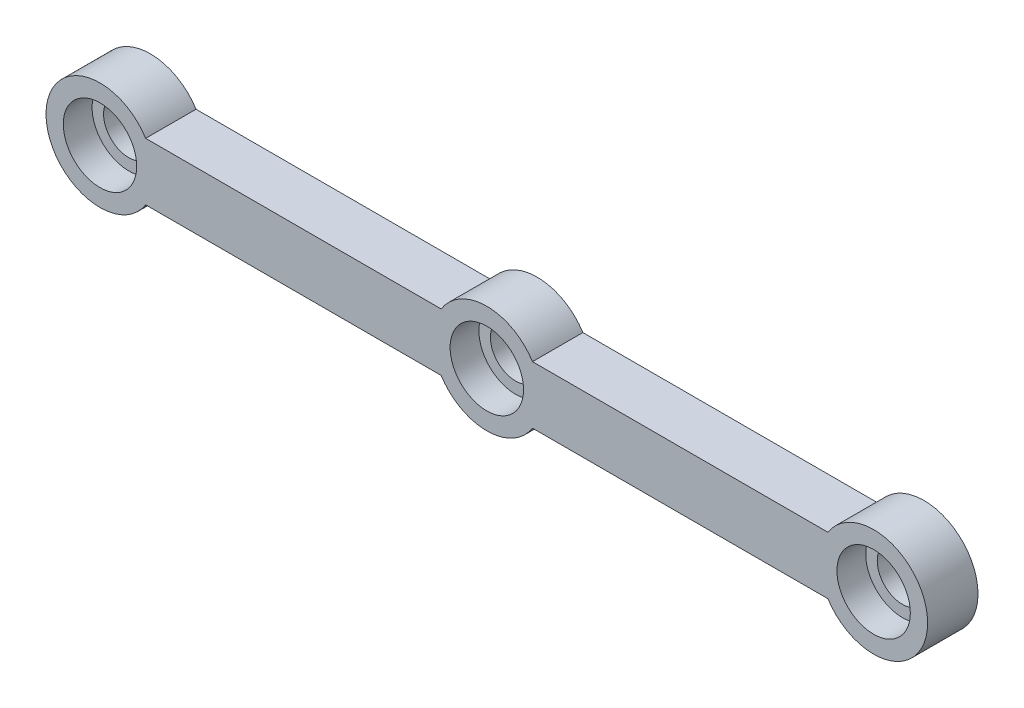
ISO-10303-21;
HEADER;
FILE_DESCRIPTION(('STEP AP214'),'2;1');
FILE_NAME('part.step','',(''),(''),'','','');
FILE_SCHEMA(('AUTOMOTIVE_DESIGN { 1 0 10303 214 1 1 1 1 }'));
ENDSEC;
DATA;
#1=APPLICATION_CONTEXT('core data for automotive mechanical design processes');
#2=APPLICATION_PROTOCOL_DEFINITION('international standard','automotive_design',2000,#1);
#3=PRODUCT_CONTEXT('',#1,'mechanical');
#4=PRODUCT('Part','Part','',(#3));
#5=PRODUCT_RELATED_PRODUCT_CATEGORY('part','',(#4));
#6=PRODUCT_DEFINITION_FORMATION('','',#4);
#7=PRODUCT_DEFINITION_CONTEXT('part definition',#1,'design');
#8=PRODUCT_DEFINITION('design','',#6,#7);
#9=PRODUCT_DEFINITION_SHAPE('','',#8);
#10=(LENGTH_UNIT() NAMED_UNIT(*) SI_UNIT(.MILLI.,.METRE.));
#11=(NAMED_UNIT(*) PLANE_ANGLE_UNIT() SI_UNIT($,.RADIAN.));
#12=(NAMED_UNIT(*) SI_UNIT($,.STERADIAN.) SOLID_ANGLE_UNIT());
#13=UNCERTAINTY_MEASURE_WITH_UNIT(LENGTH_MEASURE(1.E-05),#10,'distance_accuracy_value','');
#14=(GEOMETRIC_REPRESENTATION_CONTEXT(3) GLOBAL_UNCERTAINTY_ASSIGNED_CONTEXT((#13)) GLOBAL_UNIT_ASSIGNED_CONTEXT((#10,
#11,#12)) REPRESENTATION_CONTEXT('',''));
#15=CARTESIAN_POINT('',(0.,0.,0.));
#16=DIRECTION('',(0.,0.,1.));
#17=DIRECTION('',(1.,0.,0.));
#18=AXIS2_PLACEMENT_3D('',#15,#16,#17);
#19=CARTESIAN_POINT('',(-59.9999999999999,4.,3.));
#20=DIRECTION('',(0.,-1.,0.));
#21=DIRECTION('',(0.,0.,-1.));
#22=AXIS2_PLACEMENT_3D('',#19,#20,#21);
#23=PLANE('',#22);
#24=DIRECTION('',(-1.,0.,0.));
#25=VECTOR('',#24,1.);
#26=CARTESIAN_POINT('',(-59.9999999999999,4.,3.));
#27=LINE('',#26,#25);
#28=CARTESIAN_POINT('',(47.3943322578825,4.,3.));
#29=VERTEX_POINT('',#28);
#30=CARTESIAN_POINT('',(6.34428877022483,4.,3.));
#31=VERTEX_POINT('',#30);
#32=EDGE_CURVE('E120',#29,#31,#27,.T.);
#33=ORIENTED_EDGE('',*,*,#32,.F.);
#34=DIRECTION('',(0.,0.,1.));
#35=VECTOR('',#34,1.);
#36=CARTESIAN_POINT('',(47.3943322578825,4.,-4.));
#37=LINE('',#36,#35);
#38=CARTESIAN_POINT('',(47.3943322578825,4.,-4.));
#39=VERTEX_POINT('',#38);
#40=EDGE_CURVE('E106',#29,#39,#37,.F.);
#41=ORIENTED_EDGE('',*,*,#40,.T.);
#42=DIRECTION('',(1.,0.,0.));
#43=VECTOR('',#42,1.);
#44=CARTESIAN_POINT('',(0.,4.,-4.));
#45=LINE('',#44,#43);
#46=CARTESIAN_POINT('',(6.34428877022483,4.,-4.));
#47=VERTEX_POINT('',#46);
#48=EDGE_CURVE('E119',#47,#39,#45,.T.);
#49=ORIENTED_EDGE('',*,*,#48,.F.);
#50=DIRECTION('',(0.,0.,1.));
#51=VECTOR('',#50,1.);
#52=CARTESIAN_POINT('',(6.34428877022483,4.,-4.));
#53=LINE('',#52,#51);
#54=EDGE_CURVE('E196',#47,#31,#53,.T.);
#55=ORIENTED_EDGE('',*,*,#54,.T.);
#56=EDGE_LOOP('',(#33,#41,#49,#55));
#57=FACE_BOUND('',#56,.T.);
#58=ADVANCED_FACE('F38',(#57),#23,.F.);
#59=CARTESIAN_POINT('',(-59.9999999999999,-4.,3.));
#60=DIRECTION('',(0.,1.,0.));
#61=DIRECTION('',(0.,0.,1.));
#62=AXIS2_PLACEMENT_3D('',#59,#60,#61);
#63=PLANE('',#62);
#64=DIRECTION('',(-1.,0.,0.));
#65=VECTOR('',#64,1.);
#66=CARTESIAN_POINT('',(0.,-4.,-4.));
#67=LINE('',#66,#65);
#68=CARTESIAN_POINT('',(-6.34428877022469,-4.,-4.));
#69=VERTEX_POINT('',#68);
#70=CARTESIAN_POINT('',(-47.3943322578736,-4.,-4.));
#71=VERTEX_POINT('',#70);
#72=EDGE_CURVE('E131',#69,#71,#67,.T.);
#73=ORIENTED_EDGE('',*,*,#72,.F.);
#74=DIRECTION('',(0.,0.,1.));
#75=VECTOR('',#74,1.);
#76=CARTESIAN_POINT('',(-6.34428877022469,-4.,-4.));
#77=LINE('',#76,#75);
#78=CARTESIAN_POINT('',(-6.34428877022469,-4.,3.));
#79=VERTEX_POINT('',#78);
#80=EDGE_CURVE('E190',#69,#79,#77,.T.);
#81=ORIENTED_EDGE('',*,*,#80,.T.);
#82=DIRECTION('',(1.,0.,0.));
#83=VECTOR('',#82,1.);
#84=CARTESIAN_POINT('',(-59.9999999999999,-4.,3.));
#85=LINE('',#84,#83);
#86=CARTESIAN_POINT('',(-47.3943322578736,-4.,3.));
#87=VERTEX_POINT('',#86);
#88=EDGE_CURVE('E11',#87,#79,#85,.T.);
#89=ORIENTED_EDGE('',*,*,#88,.F.);
#90=DIRECTION('',(0.,0.,1.));
#91=VECTOR('',#90,1.);
#92=CARTESIAN_POINT('',(-47.3943322578736,-4.,-4.));
#93=LINE('',#92,#91);
#94=EDGE_CURVE('E202',#87,#71,#93,.F.);
#95=ORIENTED_EDGE('',*,*,#94,.T.);
#96=EDGE_LOOP('',(#73,#81,#89,#95));
#97=FACE_BOUND('',#96,.T.);
#98=ADVANCED_FACE('F218',(#97),#63,.F.);
#99=CARTESIAN_POINT('',(0.,0.,3.));
#100=DIRECTION('',(0.,0.,-1.));
#101=DIRECTION('',(-1.,0.,0.));
#102=AXIS2_PLACEMENT_3D('',#99,#100,#101);
#103=PLANE('',#102);
#104=CARTESIAN_POINT('',(-53.7386210280983,0.,3.));
#105=DIRECTION('',(0.,0.,1.));
#106=DIRECTION('',(1.,0.,0.));
#107=AXIS2_PLACEMENT_3D('',#104,#105,#106);
#108=CIRCLE('',#107,5.1);
#109=CARTESIAN_POINT('',(-48.6386210280983,0.,3.));
#110=VERTEX_POINT('',#109);
#111=EDGE_CURVE('E159',#110,#110,#108,.T.);
#112=ORIENTED_EDGE('',*,*,#111,.F.);
#113=EDGE_LOOP('',(#112));
#114=FACE_BOUND('',#113,.T.);
#115=CARTESIAN_POINT('',(0.,0.,3.));
#116=DIRECTION('',(0.,0.,1.));
#117=DIRECTION('',(1.,0.,0.));
#118=AXIS2_PLACEMENT_3D('',#115,#116,#117);
#119=CIRCLE('',#118,5.1);
#120=CARTESIAN_POINT('',(5.1,0.,3.));
#121=VERTEX_POINT('',#120);
#122=EDGE_CURVE('E165',#121,#121,#119,.T.);
#123=ORIENTED_EDGE('',*,*,#122,.F.);
#124=EDGE_LOOP('',(#123));
#125=FACE_BOUND('',#124,.T.);
#126=CARTESIAN_POINT('',(53.7386210281073,0.,3.));
#127=DIRECTION('',(0.,0.,1.));
#128=DIRECTION('',(1.,0.,0.));
#129=AXIS2_PLACEMENT_3D('',#126,#127,#128);
#130=CIRCLE('',#129,5.1);
#131=CARTESIAN_POINT('',(58.8386210281073,0.,3.));
#132=VERTEX_POINT('',#131);
#133=EDGE_CURVE('E173',#132,#132,#130,.T.);
#134=ORIENTED_EDGE('',*,*,#133,.F.);
#135=EDGE_LOOP('',(#134));
#136=FACE_BOUND('',#135,.T.);
#137=CARTESIAN_POINT('',(53.7386210281073,0.,3.));
#138=DIRECTION('',(0.,0.,1.));
#139=DIRECTION('',(1.,0.,0.));
#140=AXIS2_PLACEMENT_3D('',#137,#138,#139);
#141=CIRCLE('',#140,7.5);
#142=CARTESIAN_POINT('',(47.3943322578825,-4.,3.));
#143=VERTEX_POINT('',#142);
#144=EDGE_CURVE('E113',#143,#29,#141,.T.);
#145=ORIENTED_EDGE('',*,*,#144,.T.);
#146=ORIENTED_EDGE('',*,*,#32,.T.);
#147=CARTESIAN_POINT('',(0.,0.,3.));
#148=DIRECTION('',(0.,0.,1.));
#149=DIRECTION('',(1.,0.,0.));
#150=AXIS2_PLACEMENT_3D('',#147,#148,#149);
#151=CIRCLE('',#150,7.5);
#152=CARTESIAN_POINT('',(-6.34428877022469,4.,3.));
#153=VERTEX_POINT('',#152);
#154=EDGE_CURVE('E55',#31,#153,#151,.T.);
#155=ORIENTED_EDGE('',*,*,#154,.T.);
#156=CARTESIAN_POINT('',(-47.3943322578735,4.,3.));
#157=VERTEX_POINT('',#156);
#158=EDGE_CURVE('E130',#153,#157,#27,.T.);
#159=ORIENTED_EDGE('',*,*,#158,.T.);
#160=CARTESIAN_POINT('',(-53.7386210280983,0.,3.));
#161=DIRECTION('',(0.,0.,1.));
#162=DIRECTION('',(1.,0.,0.));
#163=AXIS2_PLACEMENT_3D('',#160,#161,#162);
#164=CIRCLE('',#163,7.5);
#165=EDGE_CURVE('E198',#157,#87,#164,.T.);
#166=ORIENTED_EDGE('',*,*,#165,.T.);
#167=ORIENTED_EDGE('',*,*,#88,.T.);
#168=CARTESIAN_POINT('',(6.34428877022483,-4.,3.));
#169=VERTEX_POINT('',#168);
#170=EDGE_CURVE('E61',#79,#169,#151,.T.);
#171=ORIENTED_EDGE('',*,*,#170,.T.);
#172=EDGE_CURVE('E47',#169,#143,#85,.T.);
#173=ORIENTED_EDGE('',*,*,#172,.T.);
#174=EDGE_LOOP('',(#145,#146,#155,#159,#166,#167,#171,#173));
#175=FACE_BOUND('',#174,.T.);
#176=ADVANCED_FACE('F221',(#114,#125,#136,#175),#103,.F.);
#177=ORIENTED_EDGE('',*,*,#158,.F.);
#178=DIRECTION('',(0.,0.,1.));
#179=VECTOR('',#178,1.);
#180=CARTESIAN_POINT('',(-6.34428877022469,4.,-4.));
#181=LINE('',#180,#179);
#182=CARTESIAN_POINT('',(-6.34428877022469,4.,-4.));
#183=VERTEX_POINT('',#182);
#184=EDGE_CURVE('E193',#153,#183,#181,.F.);
#185=ORIENTED_EDGE('',*,*,#184,.T.);
#186=CARTESIAN_POINT('',(-47.3943322578735,4.,-4.));
#187=VERTEX_POINT('',#186);
#188=EDGE_CURVE('E127',#187,#183,#45,.T.);
#189=ORIENTED_EDGE('',*,*,#188,.F.);
#190=DIRECTION('',(0.,0.,1.));
#191=VECTOR('',#190,1.);
#192=CARTESIAN_POINT('',(-47.3943322578735,4.,-4.));
#193=LINE('',#192,#191);
#194=EDGE_CURVE('E206',#187,#157,#193,.T.);
#195=ORIENTED_EDGE('',*,*,#194,.T.);
#196=EDGE_LOOP('',(#177,#185,#189,#195));
#197=FACE_BOUND('',#196,.T.);
#198=ADVANCED_FACE('F40',(#197),#23,.F.);
#199=CARTESIAN_POINT('',(47.3943322578825,-4.,-4.));
#200=VERTEX_POINT('',#199);
#201=CARTESIAN_POINT('',(6.34428877022483,-4.,-4.));
#202=VERTEX_POINT('',#201);
#203=EDGE_CURVE('E128',#200,#202,#67,.T.);
#204=ORIENTED_EDGE('',*,*,#203,.F.);
#205=DIRECTION('',(0.,0.,1.));
#206=VECTOR('',#205,1.);
#207=CARTESIAN_POINT('',(47.3943322578825,-4.,-4.));
#208=LINE('',#207,#206);
#209=EDGE_CURVE('E109',#200,#143,#208,.T.);
#210=ORIENTED_EDGE('',*,*,#209,.T.);
#211=ORIENTED_EDGE('',*,*,#172,.F.);
#212=DIRECTION('',(0.,0.,1.));
#213=VECTOR('',#212,1.);
#214=CARTESIAN_POINT('',(6.34428877022483,-4.,-4.));
#215=LINE('',#214,#213);
#216=EDGE_CURVE('E186',#169,#202,#215,.F.);
#217=ORIENTED_EDGE('',*,*,#216,.T.);
#218=EDGE_LOOP('',(#204,#210,#211,#217));
#219=FACE_BOUND('',#218,.T.);
#220=ADVANCED_FACE('F238',(#219),#63,.F.);
#221=CARTESIAN_POINT('',(0.,0.,-4.));
#222=DIRECTION('',(0.,0.,-1.));
#223=DIRECTION('',(-1.,0.,0.));
#224=AXIS2_PLACEMENT_3D('',#221,#222,#223);
#225=PLANE('',#224);
#226=CARTESIAN_POINT('',(53.7386210281073,0.,-4.));
#227=DIRECTION('',(0.,0.,-1.));
#228=DIRECTION('',(-1.,0.,0.));
#229=AXIS2_PLACEMENT_3D('',#226,#227,#228);
#230=CIRCLE('',#229,3.5);
#231=CARTESIAN_POINT('',(50.2386210281072,0.,-4.));
#232=VERTEX_POINT('',#231);
#233=EDGE_CURVE('E139',#232,#232,#230,.T.);
#234=ORIENTED_EDGE('',*,*,#233,.F.);
#235=EDGE_LOOP('',(#234));
#236=FACE_BOUND('',#235,.T.);
#237=CARTESIAN_POINT('',(0.,0.,-4.));
#238=DIRECTION('',(0.,0.,-1.));
#239=DIRECTION('',(-1.,0.,0.));
#240=AXIS2_PLACEMENT_3D('',#237,#238,#239);
#241=CIRCLE('',#240,3.5);
#242=CARTESIAN_POINT('',(-3.5,0.,-4.));
#243=VERTEX_POINT('',#242);
#244=EDGE_CURVE('E162',#243,#243,#241,.T.);
#245=ORIENTED_EDGE('',*,*,#244,.F.);
#246=EDGE_LOOP('',(#245));
#247=FACE_BOUND('',#246,.T.);
#248=CARTESIAN_POINT('',(-53.7386210280983,0.,-4.));
#249=DIRECTION('',(0.,0.,-1.));
#250=DIRECTION('',(-1.,0.,0.));
#251=AXIS2_PLACEMENT_3D('',#248,#249,#250);
#252=CIRCLE('',#251,3.5);
#253=CARTESIAN_POINT('',(-57.2386210280983,0.,-4.));
#254=VERTEX_POINT('',#253);
#255=EDGE_CURVE('E158',#254,#254,#252,.T.);
#256=ORIENTED_EDGE('',*,*,#255,.F.);
#257=EDGE_LOOP('',(#256));
#258=FACE_BOUND('',#257,.T.);
#259=CARTESIAN_POINT('',(53.7386210281073,0.,-4.));
#260=DIRECTION('',(0.,0.,1.));
#261=DIRECTION('',(1.,0.,0.));
#262=AXIS2_PLACEMENT_3D('',#259,#260,#261);
#263=CIRCLE('',#262,7.5);
#264=EDGE_CURVE('E103',#200,#39,#263,.T.);
#265=ORIENTED_EDGE('',*,*,#264,.F.);
#266=ORIENTED_EDGE('',*,*,#203,.T.);
#267=CARTESIAN_POINT('',(0.,0.,-4.));
#268=DIRECTION('',(0.,0.,1.));
#269=DIRECTION('',(1.,0.,0.));
#270=AXIS2_PLACEMENT_3D('',#267,#268,#269);
#271=CIRCLE('',#270,7.5);
#272=EDGE_CURVE('E121',#69,#202,#271,.T.);
#273=ORIENTED_EDGE('',*,*,#272,.F.);
#274=ORIENTED_EDGE('',*,*,#72,.T.);
#275=CARTESIAN_POINT('',(-53.7386210280983,0.,-4.));
#276=DIRECTION('',(0.,0.,1.));
#277=DIRECTION('',(1.,0.,0.));
#278=AXIS2_PLACEMENT_3D('',#275,#276,#277);
#279=CIRCLE('',#278,7.5);
#280=EDGE_CURVE('E199',#187,#71,#279,.T.);
#281=ORIENTED_EDGE('',*,*,#280,.F.);
#282=ORIENTED_EDGE('',*,*,#188,.T.);
#283=EDGE_CURVE('E126',#47,#183,#271,.T.);
#284=ORIENTED_EDGE('',*,*,#283,.F.);
#285=ORIENTED_EDGE('',*,*,#48,.T.);
#286=EDGE_LOOP('',(#265,#266,#273,#274,#281,#282,#284,#285));
#287=FACE_BOUND('',#286,.T.);
#288=ADVANCED_FACE('F124',(#236,#247,#258,#287),#225,.T.);
#289=CARTESIAN_POINT('',(-53.7386210280983,0.,-4.));
#290=DIRECTION('',(0.,0.,1.));
#291=DIRECTION('',(1.,0.,0.));
#292=AXIS2_PLACEMENT_3D('',#289,#290,#291);
#293=CYLINDRICAL_SURFACE('',#292,7.5);
#294=ORIENTED_EDGE('',*,*,#194,.F.);
#295=ORIENTED_EDGE('',*,*,#280,.T.);
#296=ORIENTED_EDGE('',*,*,#94,.F.);
#297=ORIENTED_EDGE('',*,*,#165,.F.);
#298=EDGE_LOOP('',(#294,#295,#296,#297));
#299=FACE_BOUND('',#298,.T.);
#300=ADVANCED_FACE('F220',(#299),#293,.T.);
#301=CARTESIAN_POINT('',(0.,0.,-4.));
#302=DIRECTION('',(0.,0.,1.));
#303=DIRECTION('',(1.,0.,0.));
#304=AXIS2_PLACEMENT_3D('',#301,#302,#303);
#305=CYLINDRICAL_SURFACE('',#304,7.5);
#306=ORIENTED_EDGE('',*,*,#80,.F.);
#307=ORIENTED_EDGE('',*,*,#272,.T.);
#308=ORIENTED_EDGE('',*,*,#216,.F.);
#309=ORIENTED_EDGE('',*,*,#170,.F.);
#310=EDGE_LOOP('',(#306,#307,#308,#309));
#311=FACE_BOUND('',#310,.T.);
#312=ADVANCED_FACE('F225',(#311),#305,.T.);
#313=ORIENTED_EDGE('',*,*,#54,.F.);
#314=ORIENTED_EDGE('',*,*,#283,.T.);
#315=ORIENTED_EDGE('',*,*,#184,.F.);
#316=ORIENTED_EDGE('',*,*,#154,.F.);
#317=EDGE_LOOP('',(#313,#314,#315,#316));
#318=FACE_BOUND('',#317,.T.);
#319=ADVANCED_FACE('F223',(#318),#305,.T.);
#320=CARTESIAN_POINT('',(53.7386210281073,0.,-4.));
#321=DIRECTION('',(0.,0.,1.));
#322=DIRECTION('',(1.,0.,0.));
#323=AXIS2_PLACEMENT_3D('',#320,#321,#322);
#324=CYLINDRICAL_SURFACE('',#323,7.5);
#325=ORIENTED_EDGE('',*,*,#40,.F.);
#326=ORIENTED_EDGE('',*,*,#144,.F.);
#327=ORIENTED_EDGE('',*,*,#209,.F.);
#328=ORIENTED_EDGE('',*,*,#264,.T.);
#329=EDGE_LOOP('',(#325,#326,#327,#328));
#330=FACE_BOUND('',#329,.T.);
#331=ADVANCED_FACE('F105',(#330),#324,.T.);
#332=CARTESIAN_POINT('',(-53.7386210280983,0.,-1.));
#333=DIRECTION('',(0.,0.,1.));
#334=DIRECTION('',(1.,0.,0.));
#335=AXIS2_PLACEMENT_3D('',#332,#333,#334);
#336=PLANE('',#335);
#337=CARTESIAN_POINT('',(-53.7386210280983,0.,-1.));
#338=DIRECTION('',(0.,0.,1.));
#339=DIRECTION('',(1.,0.,0.));
#340=AXIS2_PLACEMENT_3D('',#337,#338,#339);
#341=CIRCLE('',#340,3.5);
#342=CARTESIAN_POINT('',(-50.2386210280983,0.,-1.));
#343=VERTEX_POINT('',#342);
#344=EDGE_CURVE('E42',#343,#343,#341,.T.);
#345=ORIENTED_EDGE('',*,*,#344,.F.);
#346=EDGE_LOOP('',(#345));
#347=FACE_BOUND('',#346,.T.);
#348=CARTESIAN_POINT('',(-53.7386210280983,0.,-1.));
#349=DIRECTION('',(0.,0.,1.));
#350=DIRECTION('',(1.,0.,0.));
#351=AXIS2_PLACEMENT_3D('',#348,#349,#350);
#352=CIRCLE('',#351,5.1);
#353=CARTESIAN_POINT('',(-48.6386210280983,0.,-1.));
#354=VERTEX_POINT('',#353);
#355=EDGE_CURVE('E156',#354,#354,#352,.F.);
#356=ORIENTED_EDGE('',*,*,#355,.F.);
#357=EDGE_LOOP('',(#356));
#358=FACE_BOUND('',#357,.T.);
#359=ADVANCED_FACE('F149',(#347,#358),#336,.T.);
#360=CARTESIAN_POINT('',(53.7386210281073,0.,-1.));
#361=DIRECTION('',(0.,0.,1.));
#362=DIRECTION('',(1.,0.,0.));
#363=AXIS2_PLACEMENT_3D('',#360,#361,#362);
#364=PLANE('',#363);
#365=CARTESIAN_POINT('',(53.7386210281073,0.,-1.));
#366=DIRECTION('',(0.,0.,1.));
#367=DIRECTION('',(1.,0.,0.));
#368=AXIS2_PLACEMENT_3D('',#365,#366,#367);
#369=CIRCLE('',#368,3.5);
#370=CARTESIAN_POINT('',(57.2386210281073,0.,-1.));
#371=VERTEX_POINT('',#370);
#372=EDGE_CURVE('E138',#371,#371,#369,.T.);
#373=ORIENTED_EDGE('',*,*,#372,.F.);
#374=EDGE_LOOP('',(#373));
#375=FACE_BOUND('',#374,.T.);
#376=CARTESIAN_POINT('',(53.7386210281073,0.,-1.));
#377=DIRECTION('',(0.,0.,1.));
#378=DIRECTION('',(1.,0.,0.));
#379=AXIS2_PLACEMENT_3D('',#376,#377,#378);
#380=CIRCLE('',#379,5.1);
#381=CARTESIAN_POINT('',(58.8386210281073,0.,-1.));
#382=VERTEX_POINT('',#381);
#383=EDGE_CURVE('E176',#382,#382,#380,.F.);
#384=ORIENTED_EDGE('',*,*,#383,.F.);
#385=EDGE_LOOP('',(#384));
#386=FACE_BOUND('',#385,.T.);
#387=ADVANCED_FACE('F152',(#375,#386),#364,.T.);
#388=CARTESIAN_POINT('',(0.,0.,-1.));
#389=DIRECTION('',(0.,0.,1.));
#390=DIRECTION('',(1.,0.,0.));
#391=AXIS2_PLACEMENT_3D('',#388,#389,#390);
#392=PLANE('',#391);
#393=CARTESIAN_POINT('',(0.,0.,-1.));
#394=DIRECTION('',(0.,0.,1.));
#395=DIRECTION('',(1.,0.,0.));
#396=AXIS2_PLACEMENT_3D('',#393,#394,#395);
#397=CIRCLE('',#396,3.5);
#398=CARTESIAN_POINT('',(3.5,0.,-1.));
#399=VERTEX_POINT('',#398);
#400=EDGE_CURVE('E136',#399,#399,#397,.T.);
#401=ORIENTED_EDGE('',*,*,#400,.F.);
#402=EDGE_LOOP('',(#401));
#403=FACE_BOUND('',#402,.T.);
#404=CARTESIAN_POINT('',(0.,0.,-1.));
#405=DIRECTION('',(0.,0.,1.));
#406=DIRECTION('',(1.,0.,0.));
#407=AXIS2_PLACEMENT_3D('',#404,#405,#406);
#408=CIRCLE('',#407,5.1);
#409=CARTESIAN_POINT('',(5.1,0.,-1.));
#410=VERTEX_POINT('',#409);
#411=EDGE_CURVE('E170',#410,#410,#408,.F.);
#412=ORIENTED_EDGE('',*,*,#411,.F.);
#413=EDGE_LOOP('',(#412));
#414=FACE_BOUND('',#413,.T.);
#415=ADVANCED_FACE('F296',(#403,#414),#392,.T.);
#416=CARTESIAN_POINT('',(0.,0.,0.));
#417=DIRECTION('',(0.,0.,-1.));
#418=DIRECTION('',(-1.,0.,0.));
#419=AXIS2_PLACEMENT_3D('',#416,#417,#418);
#420=CYLINDRICAL_SURFACE('',#419,3.5);
#421=ORIENTED_EDGE('',*,*,#400,.T.);
#422=EDGE_LOOP('',(#421));
#423=FACE_BOUND('',#422,.T.);
#424=ORIENTED_EDGE('',*,*,#244,.T.);
#425=EDGE_LOOP('',(#424));
#426=FACE_BOUND('',#425,.T.);
#427=ADVANCED_FACE('F291',(#423,#426),#420,.F.);
#428=CARTESIAN_POINT('',(53.7386210281073,0.,0.));
#429=DIRECTION('',(0.,0.,-1.));
#430=DIRECTION('',(-1.,0.,0.));
#431=AXIS2_PLACEMENT_3D('',#428,#429,#430);
#432=CYLINDRICAL_SURFACE('',#431,3.5);
#433=ORIENTED_EDGE('',*,*,#372,.T.);
#434=EDGE_LOOP('',(#433));
#435=FACE_BOUND('',#434,.T.);
#436=ORIENTED_EDGE('',*,*,#233,.T.);
#437=EDGE_LOOP('',(#436));
#438=FACE_BOUND('',#437,.T.);
#439=ADVANCED_FACE('F295',(#435,#438),#432,.F.);
#440=CARTESIAN_POINT('',(-53.7386210280983,0.,0.));
#441=DIRECTION('',(0.,0.,-1.));
#442=DIRECTION('',(-1.,0.,0.));
#443=AXIS2_PLACEMENT_3D('',#440,#441,#442);
#444=CYLINDRICAL_SURFACE('',#443,3.5);
#445=ORIENTED_EDGE('',*,*,#344,.T.);
#446=EDGE_LOOP('',(#445));
#447=FACE_BOUND('',#446,.T.);
#448=ORIENTED_EDGE('',*,*,#255,.T.);
#449=EDGE_LOOP('',(#448));
#450=FACE_BOUND('',#449,.T.);
#451=ADVANCED_FACE('F146',(#447,#450),#444,.F.);
#452=CARTESIAN_POINT('',(0.,0.,-15.4249783362056));
#453=DIRECTION('',(0.,0.,1.));
#454=DIRECTION('',(1.,0.,0.));
#455=AXIS2_PLACEMENT_3D('',#452,#453,#454);
#456=CYLINDRICAL_SURFACE('',#455,5.1);
#457=ORIENTED_EDGE('',*,*,#411,.T.);
#458=EDGE_LOOP('',(#457));
#459=FACE_BOUND('',#458,.T.);
#460=ORIENTED_EDGE('',*,*,#122,.T.);
#461=EDGE_LOOP('',(#460));
#462=FACE_BOUND('',#461,.T.);
#463=ADVANCED_FACE('F315',(#459,#462),#456,.F.);
#464=CARTESIAN_POINT('',(53.7386210281073,0.,-15.4249783362056));
#465=DIRECTION('',(0.,0.,1.));
#466=DIRECTION('',(1.,0.,0.));
#467=AXIS2_PLACEMENT_3D('',#464,#465,#466);
#468=CYLINDRICAL_SURFACE('',#467,5.1);
#469=ORIENTED_EDGE('',*,*,#383,.T.);
#470=EDGE_LOOP('',(#469));
#471=FACE_BOUND('',#470,.T.);
#472=ORIENTED_EDGE('',*,*,#133,.T.);
#473=EDGE_LOOP('',(#472));
#474=FACE_BOUND('',#473,.T.);
#475=ADVANCED_FACE('F342',(#471,#474),#468,.F.);
#476=CARTESIAN_POINT('',(-53.7386210280983,0.,-15.4249783362056));
#477=DIRECTION('',(0.,0.,1.));
#478=DIRECTION('',(1.,0.,0.));
#479=AXIS2_PLACEMENT_3D('',#476,#477,#478);
#480=CYLINDRICAL_SURFACE('',#479,5.1);
#481=ORIENTED_EDGE('',*,*,#355,.T.);
#482=EDGE_LOOP('',(#481));
#483=FACE_BOUND('',#482,.T.);
#484=ORIENTED_EDGE('',*,*,#111,.T.);
#485=EDGE_LOOP('',(#484));
#486=FACE_BOUND('',#485,.T.);
#487=ADVANCED_FACE('F350',(#483,#486),#480,.F.);
#488=CLOSED_SHELL('',(#58,#98,#176,#198,#220,#288,#300,#312,#319,#331,#359,#387,#415,#427,#439,
#451,#463,#475,#487));
#489=MANIFOLD_SOLID_BREP('B2',#488);
#490=ADVANCED_BREP_SHAPE_REPRESENTATION('',(#18,#489),#14);
#491=SHAPE_DEFINITION_REPRESENTATION(#9,#490);
ENDSEC;
END-ISO-10303-21;
